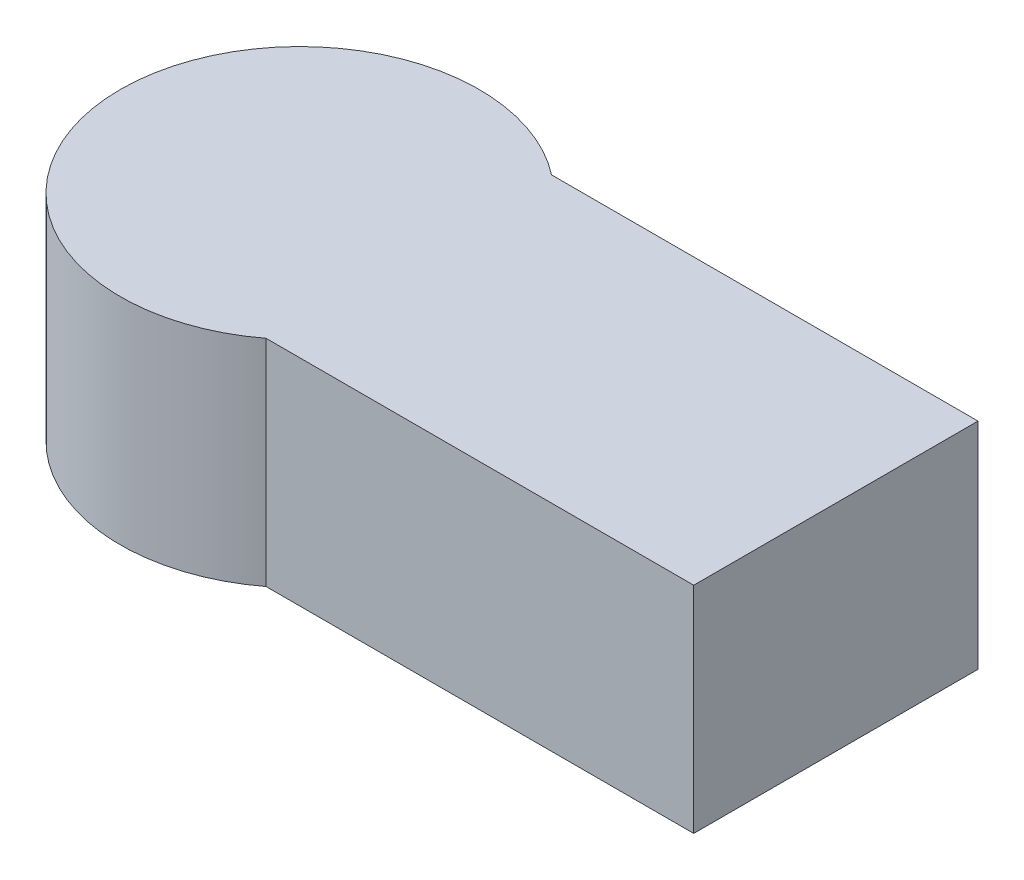
ISO-10303-21;
HEADER;
FILE_DESCRIPTION(('STEP AP214'),'2;1');
FILE_NAME('part.step','',(''),(''),'','','');
FILE_SCHEMA(('AUTOMOTIVE_DESIGN { 1 0 10303 214 1 1 1 1 }'));
ENDSEC;
DATA;
#1=APPLICATION_CONTEXT('core data for automotive mechanical design processes');
#2=APPLICATION_PROTOCOL_DEFINITION('international standard','automotive_design',2000,#1);
#3=PRODUCT_CONTEXT('',#1,'mechanical');
#4=PRODUCT('Part','Part','',(#3));
#5=PRODUCT_RELATED_PRODUCT_CATEGORY('part','',(#4));
#6=PRODUCT_DEFINITION_FORMATION('','',#4);
#7=PRODUCT_DEFINITION_CONTEXT('part definition',#1,'design');
#8=PRODUCT_DEFINITION('design','',#6,#7);
#9=PRODUCT_DEFINITION_SHAPE('','',#8);
#10=(LENGTH_UNIT() NAMED_UNIT(*) SI_UNIT(.MILLI.,.METRE.));
#11=(NAMED_UNIT(*) PLANE_ANGLE_UNIT() SI_UNIT($,.RADIAN.));
#12=(NAMED_UNIT(*) SI_UNIT($,.STERADIAN.) SOLID_ANGLE_UNIT());
#13=UNCERTAINTY_MEASURE_WITH_UNIT(LENGTH_MEASURE(1.E-05),#10,'distance_accuracy_value','');
#14=(GEOMETRIC_REPRESENTATION_CONTEXT(3) GLOBAL_UNCERTAINTY_ASSIGNED_CONTEXT((#13)) GLOBAL_UNIT_ASSIGNED_CONTEXT((#10,
#11,#12)) REPRESENTATION_CONTEXT('',''));
#15=CARTESIAN_POINT('',(0.,0.,0.));
#16=DIRECTION('',(0.,0.,1.));
#17=DIRECTION('',(1.,0.,0.));
#18=AXIS2_PLACEMENT_3D('',#15,#16,#17);
#19=CARTESIAN_POINT('',(0.,0.,0.));
#20=DIRECTION('',(0.,1.,0.));
#21=DIRECTION('',(0.,0.,1.));
#22=AXIS2_PLACEMENT_3D('',#19,#20,#21);
#23=PLANE('',#22);
#24=CARTESIAN_POINT('',(0.,0.,0.));
#25=DIRECTION('',(0.,1.,0.));
#26=DIRECTION('',(0.,0.,1.));
#27=AXIS2_PLACEMENT_3D('',#24,#25,#26);
#28=CIRCLE('',#27,50.5);
#29=CARTESIAN_POINT('',(31.,0.,-39.8653985305553));
#30=VERTEX_POINT('',#29);
#31=CARTESIAN_POINT('',(30.650673155558,0.,40.1346014694447));
#32=VERTEX_POINT('',#31);
#33=EDGE_CURVE('E211',#30,#32,#28,.T.);
#34=ORIENTED_EDGE('',*,*,#33,.F.);
#35=DIRECTION('',(1.,0.,0.));
#36=VECTOR('',#35,1.);
#37=CARTESIAN_POINT('',(31.,0.,-39.8653985305553));
#38=LINE('',#37,#36);
#39=CARTESIAN_POINT('',(151.,0.,-39.8653985305553));
#40=VERTEX_POINT('',#39);
#41=EDGE_CURVE('E218',#30,#40,#38,.T.);
#42=ORIENTED_EDGE('',*,*,#41,.T.);
#43=DIRECTION('',(0.,0.,1.));
#44=VECTOR('',#43,1.);
#45=CARTESIAN_POINT('',(151.,0.,-39.8653985305553));
#46=LINE('',#45,#44);
#47=CARTESIAN_POINT('',(151.,0.,40.1346014694447));
#48=VERTEX_POINT('',#47);
#49=EDGE_CURVE('E165',#40,#48,#46,.T.);
#50=ORIENTED_EDGE('',*,*,#49,.T.);
#51=DIRECTION('',(1.,0.,0.));
#52=VECTOR('',#51,1.);
#53=CARTESIAN_POINT('',(30.650673155558,0.,40.1346014694447));
#54=LINE('',#53,#52);
#55=EDGE_CURVE('E214',#32,#48,#54,.T.);
#56=ORIENTED_EDGE('',*,*,#55,.F.);
#57=EDGE_LOOP('',(#34,#42,#50,#56));
#58=FACE_BOUND('',#57,.T.);
#59=CARTESIAN_POINT('',(0.,0.,0.));
#60=DIRECTION('',(0.,1.,0.));
#61=DIRECTION('',(0.,0.,1.));
#62=AXIS2_PLACEMENT_3D('',#59,#60,#61);
#63=CIRCLE('',#62,49.5);
#64=CARTESIAN_POINT('',(30.655028903283,0.,-38.8653985305553));
#65=VERTEX_POINT('',#64);
#66=CARTESIAN_POINT('',(30.3106081731749,0.,39.1346014694447));
#67=VERTEX_POINT('',#66);
#68=EDGE_CURVE('E194',#65,#67,#63,.T.);
#69=ORIENTED_EDGE('',*,*,#68,.T.);
#70=DIRECTION('',(-1.,0.,0.));
#71=VECTOR('',#70,1.);
#72=CARTESIAN_POINT('',(150.,0.,39.1346014694447));
#73=LINE('',#72,#71);
#74=CARTESIAN_POINT('',(150.,0.,39.1346014694447));
#75=VERTEX_POINT('',#74);
#76=EDGE_CURVE('E199',#75,#67,#73,.T.);
#77=ORIENTED_EDGE('',*,*,#76,.F.);
#78=DIRECTION('',(0.,0.,1.));
#79=VECTOR('',#78,1.);
#80=CARTESIAN_POINT('',(150.,0.,-38.8653985305553));
#81=LINE('',#80,#79);
#82=CARTESIAN_POINT('',(150.,0.,-38.8653985305553));
#83=VERTEX_POINT('',#82);
#84=EDGE_CURVE('E205',#83,#75,#81,.T.);
#85=ORIENTED_EDGE('',*,*,#84,.F.);
#86=DIRECTION('',(-1.,0.,0.));
#87=VECTOR('',#86,1.);
#88=CARTESIAN_POINT('',(150.,0.,-38.8653985305553));
#89=LINE('',#88,#87);
#90=EDGE_CURVE('E202',#83,#65,#89,.T.);
#91=ORIENTED_EDGE('',*,*,#90,.T.);
#92=EDGE_LOOP('',(#69,#77,#85,#91));
#93=FACE_BOUND('',#92,.T.);
#94=ADVANCED_FACE('F93',(#58,#93),#23,.F.);
#95=CARTESIAN_POINT('',(150.,65.,39.1346014694447));
#96=DIRECTION('',(0.,0.,1.));
#97=DIRECTION('',(1.,0.,0.));
#98=AXIS2_PLACEMENT_3D('',#95,#96,#97);
#99=PLANE('',#98);
#100=DIRECTION('',(0.,-1.,0.));
#101=VECTOR('',#100,1.);
#102=CARTESIAN_POINT('',(30.3106081731749,65.,39.1346014694447));
#103=LINE('',#102,#101);
#104=CARTESIAN_POINT('',(30.3106081731749,57.5,39.1346014694447));
#105=VERTEX_POINT('',#104);
#106=EDGE_CURVE('E197',#105,#67,#103,.T.);
#107=ORIENTED_EDGE('',*,*,#106,.F.);
#108=DIRECTION('',(1.,0.,0.));
#109=VECTOR('',#108,1.);
#110=CARTESIAN_POINT('',(150.,57.5,39.1346014694447));
#111=LINE('',#110,#109);
#112=CARTESIAN_POINT('',(150.,57.5,39.1346014694447));
#113=VERTEX_POINT('',#112);
#114=EDGE_CURVE('E188',#105,#113,#111,.T.);
#115=ORIENTED_EDGE('',*,*,#114,.T.);
#116=DIRECTION('',(0.,-1.,0.));
#117=VECTOR('',#116,1.);
#118=CARTESIAN_POINT('',(150.,65.,39.1346014694447));
#119=LINE('',#118,#117);
#120=EDGE_CURVE('E209',#113,#75,#119,.T.);
#121=ORIENTED_EDGE('',*,*,#120,.T.);
#122=ORIENTED_EDGE('',*,*,#76,.T.);
#123=EDGE_LOOP('',(#107,#115,#121,#122));
#124=FACE_BOUND('',#123,.T.);
#125=ADVANCED_FACE('F234',(#124),#99,.F.);
#126=CARTESIAN_POINT('',(150.,65.,-38.8653985305553));
#127=DIRECTION('',(0.,0.,1.));
#128=DIRECTION('',(1.,0.,0.));
#129=AXIS2_PLACEMENT_3D('',#126,#127,#128);
#130=PLANE('',#129);
#131=DIRECTION('',(1.,0.,0.));
#132=VECTOR('',#131,1.);
#133=CARTESIAN_POINT('',(150.,57.5,-38.8653985305553));
#134=LINE('',#133,#132);
#135=CARTESIAN_POINT('',(30.655028903283,57.5,-38.8653985305553));
#136=VERTEX_POINT('',#135);
#137=CARTESIAN_POINT('',(150.,57.5,-38.8653985305553));
#138=VERTEX_POINT('',#137);
#139=EDGE_CURVE('E186',#136,#138,#134,.T.);
#140=ORIENTED_EDGE('',*,*,#139,.F.);
#141=DIRECTION('',(0.,-1.,0.));
#142=VECTOR('',#141,1.);
#143=CARTESIAN_POINT('',(30.6550289032829,65.,-38.8653985305553));
#144=LINE('',#143,#142);
#145=EDGE_CURVE('E101',#136,#65,#144,.T.);
#146=ORIENTED_EDGE('',*,*,#145,.T.);
#147=ORIENTED_EDGE('',*,*,#90,.F.);
#148=DIRECTION('',(0.,-1.,0.));
#149=VECTOR('',#148,1.);
#150=CARTESIAN_POINT('',(150.,65.,-38.8653985305553));
#151=LINE('',#150,#149);
#152=EDGE_CURVE('E208',#138,#83,#151,.T.);
#153=ORIENTED_EDGE('',*,*,#152,.F.);
#154=EDGE_LOOP('',(#140,#146,#147,#153));
#155=FACE_BOUND('',#154,.T.);
#156=ADVANCED_FACE('F229',(#155),#130,.T.);
#157=CARTESIAN_POINT('',(0.,65.,0.));
#158=DIRECTION('',(0.,-1.,0.));
#159=DIRECTION('',(0.,0.,-1.));
#160=AXIS2_PLACEMENT_3D('',#157,#158,#159);
#161=CYLINDRICAL_SURFACE('',#160,50.5);
#162=DIRECTION('',(0.,-1.,0.));
#163=VECTOR('',#162,1.);
#164=CARTESIAN_POINT('',(30.650673155558,65.,40.1346014694447));
#165=LINE('',#164,#163);
#166=CARTESIAN_POINT('',(30.650673155558,60.5,40.1346014694447));
#167=VERTEX_POINT('',#166);
#168=EDGE_CURVE('E222',#167,#32,#165,.T.);
#169=ORIENTED_EDGE('',*,*,#168,.F.);
#170=CARTESIAN_POINT('',(0.,60.5,0.));
#171=DIRECTION('',(0.,1.,0.));
#172=DIRECTION('',(0.,0.,1.));
#173=AXIS2_PLACEMENT_3D('',#170,#171,#172);
#174=CIRCLE('',#173,50.5);
#175=CARTESIAN_POINT('',(31.,60.5,-39.8653985305553));
#176=VERTEX_POINT('',#175);
#177=EDGE_CURVE('E176',#176,#167,#174,.T.);
#178=ORIENTED_EDGE('',*,*,#177,.F.);
#179=DIRECTION('',(0.,-1.,0.));
#180=VECTOR('',#179,1.);
#181=CARTESIAN_POINT('',(31.,65.,-39.8653985305553));
#182=LINE('',#181,#180);
#183=EDGE_CURVE('E115',#176,#30,#182,.T.);
#184=ORIENTED_EDGE('',*,*,#183,.T.);
#185=ORIENTED_EDGE('',*,*,#33,.T.);
#186=EDGE_LOOP('',(#169,#178,#184,#185));
#187=FACE_BOUND('',#186,.T.);
#188=ADVANCED_FACE('F95',(#187),#161,.T.);
#189=CARTESIAN_POINT('',(30.650673155558,65.,40.1346014694447));
#190=DIRECTION('',(0.,0.,-1.));
#191=DIRECTION('',(-1.,0.,0.));
#192=AXIS2_PLACEMENT_3D('',#189,#190,#191);
#193=PLANE('',#192);
#194=DIRECTION('',(0.,-1.,0.));
#195=VECTOR('',#194,1.);
#196=CARTESIAN_POINT('',(151.,65.,40.1346014694447));
#197=LINE('',#196,#195);
#198=CARTESIAN_POINT('',(151.,60.5,40.1346014694447));
#199=VERTEX_POINT('',#198);
#200=EDGE_CURVE('E169',#199,#48,#197,.T.);
#201=ORIENTED_EDGE('',*,*,#200,.F.);
#202=DIRECTION('',(1.,0.,0.));
#203=VECTOR('',#202,1.);
#204=CARTESIAN_POINT('',(151.,60.5,40.1346014694447));
#205=LINE('',#204,#203);
#206=EDGE_CURVE('E181',#167,#199,#205,.T.);
#207=ORIENTED_EDGE('',*,*,#206,.F.);
#208=ORIENTED_EDGE('',*,*,#168,.T.);
#209=ORIENTED_EDGE('',*,*,#55,.T.);
#210=EDGE_LOOP('',(#201,#207,#208,#209));
#211=FACE_BOUND('',#210,.T.);
#212=ADVANCED_FACE('F225',(#211),#193,.F.);
#213=CARTESIAN_POINT('',(151.,65.,-39.8653985305553));
#214=DIRECTION('',(1.,0.,0.));
#215=DIRECTION('',(0.,0.,-1.));
#216=AXIS2_PLACEMENT_3D('',#213,#214,#215);
#217=PLANE('',#216);
#218=DIRECTION('',(0.,-1.,0.));
#219=VECTOR('',#218,1.);
#220=CARTESIAN_POINT('',(151.,65.,-39.8653985305553));
#221=LINE('',#220,#219);
#222=CARTESIAN_POINT('',(151.,60.5,-39.8653985305553));
#223=VERTEX_POINT('',#222);
#224=EDGE_CURVE('E159',#223,#40,#221,.T.);
#225=ORIENTED_EDGE('',*,*,#224,.F.);
#226=DIRECTION('',(0.,0.,-1.));
#227=VECTOR('',#226,1.);
#228=CARTESIAN_POINT('',(151.,60.5,-39.8653985305553));
#229=LINE('',#228,#227);
#230=EDGE_CURVE('E163',#199,#223,#229,.T.);
#231=ORIENTED_EDGE('',*,*,#230,.F.);
#232=ORIENTED_EDGE('',*,*,#200,.T.);
#233=ORIENTED_EDGE('',*,*,#49,.F.);
#234=EDGE_LOOP('',(#225,#231,#232,#233));
#235=FACE_BOUND('',#234,.T.);
#236=ADVANCED_FACE('F161',(#235),#217,.T.);
#237=CARTESIAN_POINT('',(31.,65.,-39.8653985305553));
#238=DIRECTION('',(0.,0.,-1.));
#239=DIRECTION('',(-1.,0.,0.));
#240=AXIS2_PLACEMENT_3D('',#237,#238,#239);
#241=PLANE('',#240);
#242=ORIENTED_EDGE('',*,*,#183,.F.);
#243=DIRECTION('',(-1.,0.,0.));
#244=VECTOR('',#243,1.);
#245=CARTESIAN_POINT('',(151.,60.5,-39.8653985305553));
#246=LINE('',#245,#244);
#247=EDGE_CURVE('E172',#223,#176,#246,.T.);
#248=ORIENTED_EDGE('',*,*,#247,.F.);
#249=ORIENTED_EDGE('',*,*,#224,.T.);
#250=ORIENTED_EDGE('',*,*,#41,.F.);
#251=EDGE_LOOP('',(#242,#248,#249,#250));
#252=FACE_BOUND('',#251,.T.);
#253=ADVANCED_FACE('F173',(#252),#241,.T.);
#254=CARTESIAN_POINT('',(150.,65.,-38.8653985305553));
#255=DIRECTION('',(1.,0.,0.));
#256=DIRECTION('',(0.,0.,-1.));
#257=AXIS2_PLACEMENT_3D('',#254,#255,#256);
#258=PLANE('',#257);
#259=ORIENTED_EDGE('',*,*,#120,.F.);
#260=DIRECTION('',(0.,0.,-1.));
#261=VECTOR('',#260,1.);
#262=CARTESIAN_POINT('',(150.,57.5,-38.8653985305553));
#263=LINE('',#262,#261);
#264=EDGE_CURVE('E191',#113,#138,#263,.T.);
#265=ORIENTED_EDGE('',*,*,#264,.T.);
#266=ORIENTED_EDGE('',*,*,#152,.T.);
#267=ORIENTED_EDGE('',*,*,#84,.T.);
#268=EDGE_LOOP('',(#259,#265,#266,#267));
#269=FACE_BOUND('',#268,.T.);
#270=ADVANCED_FACE('F246',(#269),#258,.F.);
#271=CARTESIAN_POINT('',(0.,65.,0.));
#272=DIRECTION('',(0.,-1.,0.));
#273=DIRECTION('',(0.,0.,-1.));
#274=AXIS2_PLACEMENT_3D('',#271,#272,#273);
#275=CYLINDRICAL_SURFACE('',#274,49.5);
#276=CARTESIAN_POINT('',(0.,57.5,0.));
#277=DIRECTION('',(0.,-1.,0.));
#278=DIRECTION('',(0.,0.,-1.));
#279=AXIS2_PLACEMENT_3D('',#276,#277,#278);
#280=CIRCLE('',#279,49.5);
#281=EDGE_CURVE('E12',#105,#136,#280,.T.);
#282=ORIENTED_EDGE('',*,*,#281,.F.);
#283=ORIENTED_EDGE('',*,*,#106,.T.);
#284=ORIENTED_EDGE('',*,*,#68,.F.);
#285=ORIENTED_EDGE('',*,*,#145,.F.);
#286=EDGE_LOOP('',(#282,#283,#284,#285));
#287=FACE_BOUND('',#286,.T.);
#288=ADVANCED_FACE('F265',(#287),#275,.F.);
#289=CARTESIAN_POINT('',(0.,57.5,0.));
#290=DIRECTION('',(0.,1.,0.));
#291=DIRECTION('',(0.,0.,1.));
#292=AXIS2_PLACEMENT_3D('',#289,#290,#291);
#293=PLANE('',#292);
#294=ORIENTED_EDGE('',*,*,#114,.F.);
#295=ORIENTED_EDGE('',*,*,#281,.T.);
#296=ORIENTED_EDGE('',*,*,#139,.T.);
#297=ORIENTED_EDGE('',*,*,#264,.F.);
#298=EDGE_LOOP('',(#294,#295,#296,#297));
#299=FACE_BOUND('',#298,.T.);
#300=ADVANCED_FACE('F275',(#299),#293,.F.);
#301=CARTESIAN_POINT('',(0.,60.5,0.));
#302=DIRECTION('',(0.,1.,0.));
#303=DIRECTION('',(0.,0.,1.));
#304=AXIS2_PLACEMENT_3D('',#301,#302,#303);
#305=PLANE('',#304);
#306=ORIENTED_EDGE('',*,*,#230,.T.);
#307=ORIENTED_EDGE('',*,*,#247,.T.);
#308=ORIENTED_EDGE('',*,*,#177,.T.);
#309=ORIENTED_EDGE('',*,*,#206,.T.);
#310=EDGE_LOOP('',(#306,#307,#308,#309));
#311=FACE_BOUND('',#310,.T.);
#312=ADVANCED_FACE('F179',(#311),#305,.T.);
#313=CLOSED_SHELL('',(#94,#125,#156,#188,#212,#236,#253,#270,#288,#300,#312));
#314=MANIFOLD_SOLID_BREP('B2',#313);
#315=ADVANCED_BREP_SHAPE_REPRESENTATION('',(#18,#314),#14);
#316=SHAPE_DEFINITION_REPRESENTATION(#9,#315);
ENDSEC;
END-ISO-10303-21;
